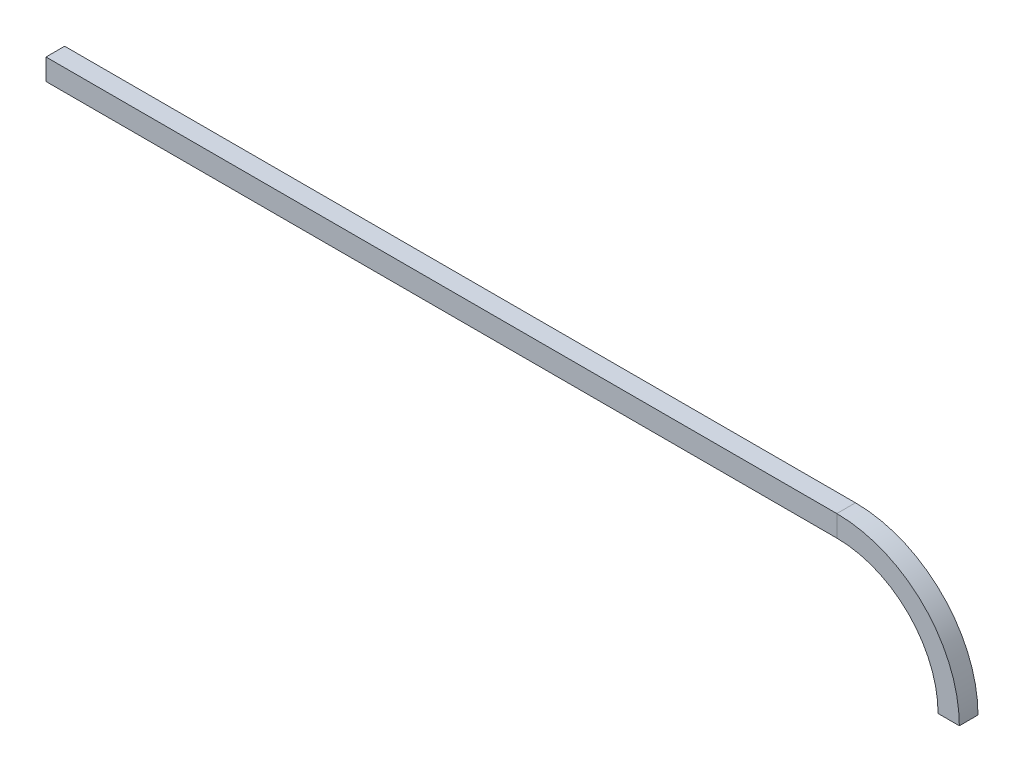
ISO-10303-21;
HEADER;
FILE_DESCRIPTION(('STEP AP214'),'2;1');
FILE_NAME('part.step','',(''),(''),'','','');
FILE_SCHEMA(('AUTOMOTIVE_DESIGN { 1 0 10303 214 1 1 1 1 }'));
ENDSEC;
DATA;
#1=APPLICATION_CONTEXT('core data for automotive mechanical design processes');
#2=APPLICATION_PROTOCOL_DEFINITION('international standard','automotive_design',2000,#1);
#3=PRODUCT_CONTEXT('',#1,'mechanical');
#4=PRODUCT('Part','Part','',(#3));
#5=PRODUCT_RELATED_PRODUCT_CATEGORY('part','',(#4));
#6=PRODUCT_DEFINITION_FORMATION('','',#4);
#7=PRODUCT_DEFINITION_CONTEXT('part definition',#1,'design');
#8=PRODUCT_DEFINITION('design','',#6,#7);
#9=PRODUCT_DEFINITION_SHAPE('','',#8);
#10=(LENGTH_UNIT() NAMED_UNIT(*) SI_UNIT(.MILLI.,.METRE.));
#11=(NAMED_UNIT(*) PLANE_ANGLE_UNIT() SI_UNIT($,.RADIAN.));
#12=(NAMED_UNIT(*) SI_UNIT($,.STERADIAN.) SOLID_ANGLE_UNIT());
#13=UNCERTAINTY_MEASURE_WITH_UNIT(LENGTH_MEASURE(1.E-05),#10,'distance_accuracy_value','');
#14=(GEOMETRIC_REPRESENTATION_CONTEXT(3) GLOBAL_UNCERTAINTY_ASSIGNED_CONTEXT((#13)) GLOBAL_UNIT_ASSIGNED_CONTEXT((#10,
#11,#12)) REPRESENTATION_CONTEXT('',''));
#15=CARTESIAN_POINT('',(0.,0.,0.));
#16=DIRECTION('',(0.,0.,1.));
#17=DIRECTION('',(1.,0.,0.));
#18=AXIS2_PLACEMENT_3D('',#15,#16,#17);
#19=CARTESIAN_POINT('',(61.468,-7.62,0.));
#20=DIRECTION('',(0.,-1.,0.));
#21=DIRECTION('',(0.,0.,-1.));
#22=AXIS2_PLACEMENT_3D('',#19,#20,#21);
#23=PLANE('',#22);
#24=DIRECTION('',(-1.,0.,0.));
#25=VECTOR('',#24,1.);
#26=CARTESIAN_POINT('',(62.1919,-7.62,0.635));
#27=LINE('',#26,#25);
#28=CARTESIAN_POINT('',(62.1919,-7.62,0.635));
#29=VERTEX_POINT('',#28);
#30=CARTESIAN_POINT('',(60.7441,-7.62,0.635));
#31=VERTEX_POINT('',#30);
#32=EDGE_CURVE('E150',#29,#31,#27,.T.);
#33=ORIENTED_EDGE('',*,*,#32,.T.);
#34=DIRECTION('',(0.,0.,-1.));
#35=VECTOR('',#34,1.);
#36=CARTESIAN_POINT('',(60.7441,-7.62,0.635));
#37=LINE('',#36,#35);
#38=CARTESIAN_POINT('',(60.7441,-7.62,-0.635));
#39=VERTEX_POINT('',#38);
#40=EDGE_CURVE('E156',#31,#39,#37,.T.);
#41=ORIENTED_EDGE('',*,*,#40,.T.);
#42=DIRECTION('',(1.,0.,0.));
#43=VECTOR('',#42,1.);
#44=CARTESIAN_POINT('',(62.1919,-7.62,-0.635));
#45=LINE('',#44,#43);
#46=CARTESIAN_POINT('',(62.1919,-7.62,-0.635));
#47=VERTEX_POINT('',#46);
#48=EDGE_CURVE('E180',#39,#47,#45,.T.);
#49=ORIENTED_EDGE('',*,*,#48,.T.);
#50=DIRECTION('',(0.,0.,1.));
#51=VECTOR('',#50,1.);
#52=CARTESIAN_POINT('',(62.1919,-7.62,0.635));
#53=LINE('',#52,#51);
#54=EDGE_CURVE('E167',#47,#29,#53,.T.);
#55=ORIENTED_EDGE('',*,*,#54,.T.);
#56=EDGE_LOOP('',(#33,#41,#49,#55));
#57=FACE_BOUND('',#56,.T.);
#58=ADVANCED_FACE('F39',(#57),#23,.T.);
#59=CARTESIAN_POINT('',(0.,0.,0.));
#60=DIRECTION('',(1.,0.,0.));
#61=DIRECTION('',(0.,0.,-1.));
#62=AXIS2_PLACEMENT_3D('',#59,#60,#61);
#63=PLANE('',#62);
#64=DIRECTION('',(0.,0.,-1.));
#65=VECTOR('',#64,1.);
#66=CARTESIAN_POINT('',(0.,0.3175,-0.3175));
#67=LINE('',#66,#65);
#68=CARTESIAN_POINT('',(0.,0.3175,0.3175));
#69=VERTEX_POINT('',#68);
#70=CARTESIAN_POINT('',(0.,0.3175,-0.3175));
#71=VERTEX_POINT('',#70);
#72=EDGE_CURVE('E144',#69,#71,#67,.T.);
#73=ORIENTED_EDGE('',*,*,#72,.F.);
#74=DIRECTION('',(0.,1.,0.));
#75=VECTOR('',#74,1.);
#76=CARTESIAN_POINT('',(0.,-0.3175,0.3175));
#77=LINE('',#76,#75);
#78=CARTESIAN_POINT('',(0.,-0.3175,0.3175));
#79=VERTEX_POINT('',#78);
#80=EDGE_CURVE('E53',#79,#69,#77,.T.);
#81=ORIENTED_EDGE('',*,*,#80,.F.);
#82=DIRECTION('',(0.,0.,1.));
#83=VECTOR('',#82,1.);
#84=CARTESIAN_POINT('',(0.,-0.3175,-0.3175));
#85=LINE('',#84,#83);
#86=CARTESIAN_POINT('',(0.,-0.3175,-0.3175));
#87=VERTEX_POINT('',#86);
#88=EDGE_CURVE('E135',#87,#79,#85,.T.);
#89=ORIENTED_EDGE('',*,*,#88,.F.);
#90=DIRECTION('',(0.,-1.,0.));
#91=VECTOR('',#90,1.);
#92=CARTESIAN_POINT('',(0.,-0.3175,-0.3175));
#93=LINE('',#92,#91);
#94=EDGE_CURVE('E138',#71,#87,#93,.T.);
#95=ORIENTED_EDGE('',*,*,#94,.F.);
#96=EDGE_LOOP('',(#73,#81,#89,#95));
#97=FACE_BOUND('',#96,.T.);
#98=DIRECTION('',(0.,-1.,0.));
#99=VECTOR('',#98,1.);
#100=CARTESIAN_POINT('',(0.,0.7239,0.635));
#101=LINE('',#100,#99);
#102=CARTESIAN_POINT('',(0.,0.7239,0.635));
#103=VERTEX_POINT('',#102);
#104=CARTESIAN_POINT('',(0.,-0.7239,0.635));
#105=VERTEX_POINT('',#104);
#106=EDGE_CURVE('E168',#103,#105,#101,.T.);
#107=ORIENTED_EDGE('',*,*,#106,.F.);
#108=DIRECTION('',(0.,0.,1.));
#109=VECTOR('',#108,1.);
#110=CARTESIAN_POINT('',(0.,0.7239,0.635));
#111=LINE('',#110,#109);
#112=CARTESIAN_POINT('',(0.,0.7239,-0.635));
#113=VERTEX_POINT('',#112);
#114=EDGE_CURVE('E11',#113,#103,#111,.T.);
#115=ORIENTED_EDGE('',*,*,#114,.F.);
#116=DIRECTION('',(0.,1.,0.));
#117=VECTOR('',#116,1.);
#118=CARTESIAN_POINT('',(0.,0.7239,-0.635));
#119=LINE('',#118,#117);
#120=CARTESIAN_POINT('',(0.,-0.7239,-0.635));
#121=VERTEX_POINT('',#120);
#122=EDGE_CURVE('E61',#121,#113,#119,.T.);
#123=ORIENTED_EDGE('',*,*,#122,.F.);
#124=DIRECTION('',(0.,0.,-1.));
#125=VECTOR('',#124,1.);
#126=CARTESIAN_POINT('',(0.,-0.7239,0.635));
#127=LINE('',#126,#125);
#128=EDGE_CURVE('E174',#105,#121,#127,.T.);
#129=ORIENTED_EDGE('',*,*,#128,.F.);
#130=EDGE_LOOP('',(#107,#115,#123,#129));
#131=FACE_BOUND('',#130,.T.);
#132=ADVANCED_FACE('F225',(#97,#131),#63,.F.);
#133=CARTESIAN_POINT('',(62.1919,-7.62,0.635));
#134=DIRECTION('',(0.,0.,-1.));
#135=DIRECTION('',(-1.,0.,0.));
#136=AXIS2_PLACEMENT_3D('',#133,#134,#135);
#137=PLANE('',#136);
#138=CARTESIAN_POINT('',(53.848,-7.62,0.635));
#139=DIRECTION('',(0.,0.,1.));
#140=DIRECTION('',(1.,0.,0.));
#141=AXIS2_PLACEMENT_3D('',#138,#139,#140);
#142=CIRCLE('',#141,6.8961);
#143=CARTESIAN_POINT('',(53.848,-0.723899999999997,0.635));
#144=VERTEX_POINT('',#143);
#145=EDGE_CURVE('E160',#31,#144,#142,.T.);
#146=ORIENTED_EDGE('',*,*,#145,.F.);
#147=ORIENTED_EDGE('',*,*,#32,.F.);
#148=CARTESIAN_POINT('',(53.848,-7.62,0.635));
#149=DIRECTION('',(0.,0.,1.));
#150=DIRECTION('',(1.,0.,0.));
#151=AXIS2_PLACEMENT_3D('',#148,#149,#150);
#152=CIRCLE('',#151,8.3439);
#153=CARTESIAN_POINT('',(53.848,0.723900000000002,0.635));
#154=VERTEX_POINT('',#153);
#155=EDGE_CURVE('E161',#29,#154,#152,.T.);
#156=ORIENTED_EDGE('',*,*,#155,.T.);
#157=DIRECTION('',(0.,-1.,0.));
#158=VECTOR('',#157,1.);
#159=CARTESIAN_POINT('',(53.848,0.723900000000001,0.635));
#160=LINE('',#159,#158);
#161=EDGE_CURVE('E157',#154,#144,#160,.T.);
#162=ORIENTED_EDGE('',*,*,#161,.T.);
#163=EDGE_LOOP('',(#146,#147,#156,#162));
#164=FACE_BOUND('',#163,.T.);
#165=ADVANCED_FACE('F214',(#164),#137,.F.);
#166=CARTESIAN_POINT('',(53.848,-7.62,0.));
#167=DIRECTION('',(0.,0.,1.));
#168=DIRECTION('',(1.,0.,0.));
#169=AXIS2_PLACEMENT_3D('',#166,#167,#168);
#170=CYLINDRICAL_SURFACE('',#169,6.8961);
#171=CARTESIAN_POINT('',(53.848,-7.62,-0.635));
#172=DIRECTION('',(0.,0.,1.));
#173=DIRECTION('',(1.,0.,0.));
#174=AXIS2_PLACEMENT_3D('',#171,#172,#173);
#175=CIRCLE('',#174,6.8961);
#176=CARTESIAN_POINT('',(53.848,-0.723899999999997,-0.635));
#177=VERTEX_POINT('',#176);
#178=EDGE_CURVE('E183',#39,#177,#175,.T.);
#179=ORIENTED_EDGE('',*,*,#178,.F.);
#180=ORIENTED_EDGE('',*,*,#40,.F.);
#181=ORIENTED_EDGE('',*,*,#145,.T.);
#182=DIRECTION('',(0.,0.,-1.));
#183=VECTOR('',#182,1.);
#184=CARTESIAN_POINT('',(53.848,-0.723899999999999,0.635));
#185=LINE('',#184,#183);
#186=EDGE_CURVE('E164',#144,#177,#185,.T.);
#187=ORIENTED_EDGE('',*,*,#186,.T.);
#188=EDGE_LOOP('',(#179,#180,#181,#187));
#189=FACE_BOUND('',#188,.T.);
#190=ADVANCED_FACE('F229',(#189),#170,.F.);
#191=CARTESIAN_POINT('',(62.1919,-7.62,-0.635));
#192=DIRECTION('',(0.,0.,1.));
#193=DIRECTION('',(1.,0.,0.));
#194=AXIS2_PLACEMENT_3D('',#191,#192,#193);
#195=PLANE('',#194);
#196=CARTESIAN_POINT('',(53.848,-7.62,-0.635));
#197=DIRECTION('',(0.,0.,1.));
#198=DIRECTION('',(1.,0.,0.));
#199=AXIS2_PLACEMENT_3D('',#196,#197,#198);
#200=CIRCLE('',#199,8.3439);
#201=CARTESIAN_POINT('',(53.848,0.723900000000002,-0.635));
#202=VERTEX_POINT('',#201);
#203=EDGE_CURVE('E194',#47,#202,#200,.T.);
#204=ORIENTED_EDGE('',*,*,#203,.F.);
#205=ORIENTED_EDGE('',*,*,#48,.F.);
#206=ORIENTED_EDGE('',*,*,#178,.T.);
#207=DIRECTION('',(0.,1.,0.));
#208=VECTOR('',#207,1.);
#209=CARTESIAN_POINT('',(53.848,0.723900000000001,-0.635));
#210=LINE('',#209,#208);
#211=EDGE_CURVE('E186',#177,#202,#210,.T.);
#212=ORIENTED_EDGE('',*,*,#211,.T.);
#213=EDGE_LOOP('',(#204,#205,#206,#212));
#214=FACE_BOUND('',#213,.T.);
#215=ADVANCED_FACE('F218',(#214),#195,.F.);
#216=CARTESIAN_POINT('',(53.848,-7.62,0.));
#217=DIRECTION('',(0.,0.,1.));
#218=DIRECTION('',(1.,0.,0.));
#219=AXIS2_PLACEMENT_3D('',#216,#217,#218);
#220=CYLINDRICAL_SURFACE('',#219,8.3439);
#221=DIRECTION('',(0.,0.,1.));
#222=VECTOR('',#221,1.);
#223=CARTESIAN_POINT('',(53.848,0.723900000000001,0.635));
#224=LINE('',#223,#222);
#225=EDGE_CURVE('E177',#202,#154,#224,.T.);
#226=ORIENTED_EDGE('',*,*,#225,.T.);
#227=ORIENTED_EDGE('',*,*,#155,.F.);
#228=ORIENTED_EDGE('',*,*,#54,.F.);
#229=ORIENTED_EDGE('',*,*,#203,.T.);
#230=EDGE_LOOP('',(#226,#227,#228,#229));
#231=FACE_BOUND('',#230,.T.);
#232=ADVANCED_FACE('F206',(#231),#220,.T.);
#233=CARTESIAN_POINT('',(53.848,0.7239,0.635));
#234=DIRECTION('',(0.,0.,-1.));
#235=DIRECTION('',(0.,1.,0.));
#236=AXIS2_PLACEMENT_3D('',#233,#234,#235);
#237=PLANE('',#236);
#238=DIRECTION('',(-1.,0.,0.));
#239=VECTOR('',#238,1.);
#240=CARTESIAN_POINT('',(53.848,-0.7239,0.635));
#241=LINE('',#240,#239);
#242=EDGE_CURVE('E170',#144,#105,#241,.T.);
#243=ORIENTED_EDGE('',*,*,#242,.F.);
#244=ORIENTED_EDGE('',*,*,#161,.F.);
#245=DIRECTION('',(-1.,0.,0.));
#246=VECTOR('',#245,1.);
#247=CARTESIAN_POINT('',(53.848,0.7239,0.635));
#248=LINE('',#247,#246);
#249=EDGE_CURVE('E171',#154,#103,#248,.T.);
#250=ORIENTED_EDGE('',*,*,#249,.T.);
#251=ORIENTED_EDGE('',*,*,#106,.T.);
#252=EDGE_LOOP('',(#243,#244,#250,#251));
#253=FACE_BOUND('',#252,.T.);
#254=ADVANCED_FACE('F210',(#253),#237,.F.);
#255=CARTESIAN_POINT('',(53.848,-0.7239,0.635));
#256=DIRECTION('',(0.,1.,0.));
#257=DIRECTION('',(0.,0.,1.));
#258=AXIS2_PLACEMENT_3D('',#255,#256,#257);
#259=PLANE('',#258);
#260=DIRECTION('',(-1.,0.,0.));
#261=VECTOR('',#260,1.);
#262=CARTESIAN_POINT('',(53.848,-0.7239,-0.635));
#263=LINE('',#262,#261);
#264=EDGE_CURVE('E188',#177,#121,#263,.T.);
#265=ORIENTED_EDGE('',*,*,#264,.F.);
#266=ORIENTED_EDGE('',*,*,#186,.F.);
#267=ORIENTED_EDGE('',*,*,#242,.T.);
#268=ORIENTED_EDGE('',*,*,#128,.T.);
#269=EDGE_LOOP('',(#265,#266,#267,#268));
#270=FACE_BOUND('',#269,.T.);
#271=ADVANCED_FACE('F227',(#270),#259,.F.);
#272=CARTESIAN_POINT('',(53.848,0.7239,-0.635));
#273=DIRECTION('',(0.,0.,1.));
#274=DIRECTION('',(0.,-1.,0.));
#275=AXIS2_PLACEMENT_3D('',#272,#273,#274);
#276=PLANE('',#275);
#277=DIRECTION('',(-1.,0.,0.));
#278=VECTOR('',#277,1.);
#279=CARTESIAN_POINT('',(53.848,0.7239,-0.635));
#280=LINE('',#279,#278);
#281=EDGE_CURVE('E46',#202,#113,#280,.T.);
#282=ORIENTED_EDGE('',*,*,#281,.F.);
#283=ORIENTED_EDGE('',*,*,#211,.F.);
#284=ORIENTED_EDGE('',*,*,#264,.T.);
#285=ORIENTED_EDGE('',*,*,#122,.T.);
#286=EDGE_LOOP('',(#282,#283,#284,#285));
#287=FACE_BOUND('',#286,.T.);
#288=ADVANCED_FACE('F220',(#287),#276,.F.);
#289=CARTESIAN_POINT('',(53.848,0.7239,0.635));
#290=DIRECTION('',(0.,-1.,0.));
#291=DIRECTION('',(0.,0.,-1.));
#292=AXIS2_PLACEMENT_3D('',#289,#290,#291);
#293=PLANE('',#292);
#294=ORIENTED_EDGE('',*,*,#114,.T.);
#295=ORIENTED_EDGE('',*,*,#249,.F.);
#296=ORIENTED_EDGE('',*,*,#225,.F.);
#297=ORIENTED_EDGE('',*,*,#281,.T.);
#298=EDGE_LOOP('',(#294,#295,#296,#297));
#299=FACE_BOUND('',#298,.T.);
#300=ADVANCED_FACE('F221',(#299),#293,.F.);
#301=CARTESIAN_POINT('',(50.8,-0.3175,0.3175));
#302=DIRECTION('',(0.,0.,1.));
#303=DIRECTION('',(1.,0.,0.));
#304=AXIS2_PLACEMENT_3D('',#301,#302,#303);
#305=PLANE('',#304);
#306=ORIENTED_EDGE('',*,*,#80,.T.);
#307=DIRECTION('',(-1.,0.,0.));
#308=VECTOR('',#307,1.);
#309=CARTESIAN_POINT('',(50.8,0.3175,0.3175));
#310=LINE('',#309,#308);
#311=CARTESIAN_POINT('',(50.8,0.3175,0.3175));
#312=VERTEX_POINT('',#311);
#313=EDGE_CURVE('E113',#312,#69,#310,.T.);
#314=ORIENTED_EDGE('',*,*,#313,.F.);
#315=DIRECTION('',(0.,1.,0.));
#316=VECTOR('',#315,1.);
#317=CARTESIAN_POINT('',(50.8,-0.3175,0.3175));
#318=LINE('',#317,#316);
#319=CARTESIAN_POINT('',(50.8,-0.3175,0.3175));
#320=VERTEX_POINT('',#319);
#321=EDGE_CURVE('E117',#320,#312,#318,.T.);
#322=ORIENTED_EDGE('',*,*,#321,.F.);
#323=DIRECTION('',(-1.,0.,0.));
#324=VECTOR('',#323,1.);
#325=CARTESIAN_POINT('',(50.8,-0.3175,0.3175));
#326=LINE('',#325,#324);
#327=EDGE_CURVE('E148',#320,#79,#326,.T.);
#328=ORIENTED_EDGE('',*,*,#327,.T.);
#329=EDGE_LOOP('',(#306,#314,#322,#328));
#330=FACE_BOUND('',#329,.T.);
#331=ADVANCED_FACE('F115',(#330),#305,.F.);
#332=CARTESIAN_POINT('',(50.8,-0.3175,-0.3175));
#333=DIRECTION('',(0.,-1.,0.));
#334=DIRECTION('',(0.,0.,-1.));
#335=AXIS2_PLACEMENT_3D('',#332,#333,#334);
#336=PLANE('',#335);
#337=ORIENTED_EDGE('',*,*,#88,.T.);
#338=ORIENTED_EDGE('',*,*,#327,.F.);
#339=DIRECTION('',(0.,0.,1.));
#340=VECTOR('',#339,1.);
#341=CARTESIAN_POINT('',(50.8,-0.3175,-0.3175));
#342=LINE('',#341,#340);
#343=CARTESIAN_POINT('',(50.8,-0.3175,-0.3175));
#344=VERTEX_POINT('',#343);
#345=EDGE_CURVE('E123',#344,#320,#342,.T.);
#346=ORIENTED_EDGE('',*,*,#345,.F.);
#347=DIRECTION('',(-1.,0.,0.));
#348=VECTOR('',#347,1.);
#349=CARTESIAN_POINT('',(50.8,-0.3175,-0.3175));
#350=LINE('',#349,#348);
#351=EDGE_CURVE('E151',#344,#87,#350,.T.);
#352=ORIENTED_EDGE('',*,*,#351,.T.);
#353=EDGE_LOOP('',(#337,#338,#346,#352));
#354=FACE_BOUND('',#353,.T.);
#355=ADVANCED_FACE('F246',(#354),#336,.F.);
#356=CARTESIAN_POINT('',(50.8,-0.3175,-0.3175));
#357=DIRECTION('',(0.,0.,-1.));
#358=DIRECTION('',(-1.,0.,0.));
#359=AXIS2_PLACEMENT_3D('',#356,#357,#358);
#360=PLANE('',#359);
#361=ORIENTED_EDGE('',*,*,#94,.T.);
#362=ORIENTED_EDGE('',*,*,#351,.F.);
#363=DIRECTION('',(0.,-1.,0.));
#364=VECTOR('',#363,1.);
#365=CARTESIAN_POINT('',(50.8,-0.3175,-0.3175));
#366=LINE('',#365,#364);
#367=CARTESIAN_POINT('',(50.8,0.3175,-0.3175));
#368=VERTEX_POINT('',#367);
#369=EDGE_CURVE('E131',#368,#344,#366,.T.);
#370=ORIENTED_EDGE('',*,*,#369,.F.);
#371=DIRECTION('',(-1.,0.,0.));
#372=VECTOR('',#371,1.);
#373=CARTESIAN_POINT('',(50.8,0.3175,-0.3175));
#374=LINE('',#373,#372);
#375=EDGE_CURVE('E122',#368,#71,#374,.T.);
#376=ORIENTED_EDGE('',*,*,#375,.T.);
#377=EDGE_LOOP('',(#361,#362,#370,#376));
#378=FACE_BOUND('',#377,.T.);
#379=ADVANCED_FACE('F258',(#378),#360,.F.);
#380=CARTESIAN_POINT('',(50.8,0.3175,-0.3175));
#381=DIRECTION('',(0.,1.,0.));
#382=DIRECTION('',(0.,0.,1.));
#383=AXIS2_PLACEMENT_3D('',#380,#381,#382);
#384=PLANE('',#383);
#385=ORIENTED_EDGE('',*,*,#72,.T.);
#386=ORIENTED_EDGE('',*,*,#375,.F.);
#387=DIRECTION('',(0.,0.,-1.));
#388=VECTOR('',#387,1.);
#389=CARTESIAN_POINT('',(50.8,0.3175,-0.3175));
#390=LINE('',#389,#388);
#391=EDGE_CURVE('E126',#312,#368,#390,.T.);
#392=ORIENTED_EDGE('',*,*,#391,.F.);
#393=ORIENTED_EDGE('',*,*,#313,.T.);
#394=EDGE_LOOP('',(#385,#386,#392,#393));
#395=FACE_BOUND('',#394,.T.);
#396=ADVANCED_FACE('F127',(#395),#384,.F.);
#397=CARTESIAN_POINT('',(50.8,0.,0.));
#398=DIRECTION('',(1.,0.,0.));
#399=DIRECTION('',(0.,0.,-1.));
#400=AXIS2_PLACEMENT_3D('',#397,#398,#399);
#401=PLANE('',#400);
#402=ORIENTED_EDGE('',*,*,#321,.T.);
#403=ORIENTED_EDGE('',*,*,#391,.T.);
#404=ORIENTED_EDGE('',*,*,#369,.T.);
#405=ORIENTED_EDGE('',*,*,#345,.T.);
#406=EDGE_LOOP('',(#402,#403,#404,#405));
#407=FACE_BOUND('',#406,.T.);
#408=ADVANCED_FACE('F133',(#407),#401,.F.);
#409=CLOSED_SHELL('',(#58,#132,#165,#190,#215,#232,#254,#271,#288,#300,#331,#355,#379,#396,#408));
#410=MANIFOLD_SOLID_BREP('B2',#409);
#411=ADVANCED_BREP_SHAPE_REPRESENTATION('',(#18,#410),#14);
#412=SHAPE_DEFINITION_REPRESENTATION(#9,#411);
ENDSEC;
END-ISO-10303-21;
